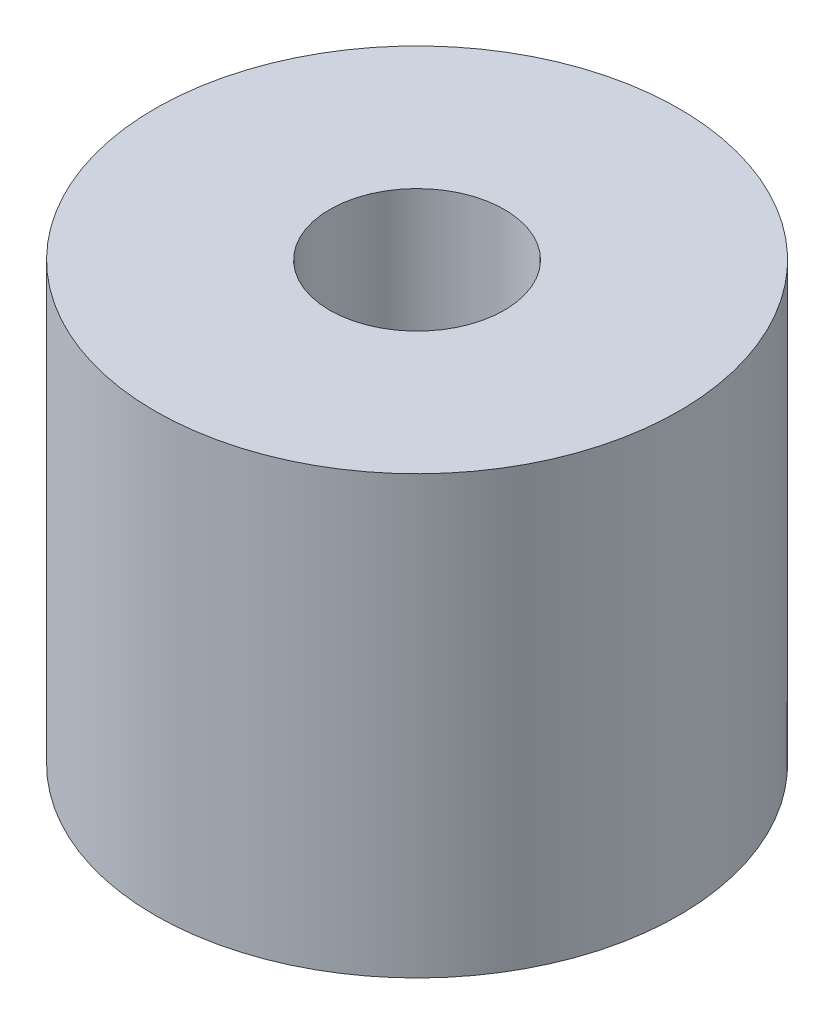
ISO-10303-21;
HEADER;
FILE_DESCRIPTION(('STEP AP214'),'2;1');
FILE_NAME('part.step','',(''),(''),'','','');
FILE_SCHEMA(('AUTOMOTIVE_DESIGN { 1 0 10303 214 1 1 1 1 }'));
ENDSEC;
DATA;
#1=APPLICATION_CONTEXT('core data for automotive mechanical design processes');
#2=APPLICATION_PROTOCOL_DEFINITION('international standard','automotive_design',2000,#1);
#3=PRODUCT_CONTEXT('',#1,'mechanical');
#4=PRODUCT('Part','Part','',(#3));
#5=PRODUCT_RELATED_PRODUCT_CATEGORY('part','',(#4));
#6=PRODUCT_DEFINITION_FORMATION('','',#4);
#7=PRODUCT_DEFINITION_CONTEXT('part definition',#1,'design');
#8=PRODUCT_DEFINITION('design','',#6,#7);
#9=PRODUCT_DEFINITION_SHAPE('','',#8);
#10=(LENGTH_UNIT() NAMED_UNIT(*) SI_UNIT(.MILLI.,.METRE.));
#11=(NAMED_UNIT(*) PLANE_ANGLE_UNIT() SI_UNIT($,.RADIAN.));
#12=(NAMED_UNIT(*) SI_UNIT($,.STERADIAN.) SOLID_ANGLE_UNIT());
#13=UNCERTAINTY_MEASURE_WITH_UNIT(LENGTH_MEASURE(1.E-05),#10,'distance_accuracy_value','');
#14=(GEOMETRIC_REPRESENTATION_CONTEXT(3) GLOBAL_UNCERTAINTY_ASSIGNED_CONTEXT((#13)) GLOBAL_UNIT_ASSIGNED_CONTEXT((#10,
#11,#12)) REPRESENTATION_CONTEXT('',''));
#15=CARTESIAN_POINT('',(0.,0.,0.));
#16=DIRECTION('',(0.,0.,1.));
#17=DIRECTION('',(1.,0.,0.));
#18=AXIS2_PLACEMENT_3D('',#15,#16,#17);
#19=CARTESIAN_POINT('',(0.,25.,0.));
#20=DIRECTION('',(0.,1.,0.));
#21=DIRECTION('',(0.,0.,1.));
#22=AXIS2_PLACEMENT_3D('',#19,#20,#21);
#23=PLANE('',#22);
#24=CARTESIAN_POINT('',(0.,25.,0.));
#25=DIRECTION('',(0.,1.,0.));
#26=DIRECTION('',(0.,0.,1.));
#27=AXIS2_PLACEMENT_3D('',#24,#25,#26);
#28=CIRCLE('',#27,15.);
#29=CARTESIAN_POINT('',(0.,25.,15.));
#30=VERTEX_POINT('',#29);
#31=EDGE_CURVE('E10',#30,#30,#28,.T.);
#32=ORIENTED_EDGE('',*,*,#31,.T.);
#33=EDGE_LOOP('',(#32));
#34=FACE_BOUND('',#33,.T.);
#35=CARTESIAN_POINT('',(0.,25.,0.));
#36=DIRECTION('',(0.,1.,0.));
#37=DIRECTION('',(0.,0.,1.));
#38=AXIS2_PLACEMENT_3D('',#35,#36,#37);
#39=CIRCLE('',#38,5.);
#40=CARTESIAN_POINT('',(0.,25.,5.));
#41=VERTEX_POINT('',#40);
#42=EDGE_CURVE('E40',#41,#41,#39,.T.);
#43=ORIENTED_EDGE('',*,*,#42,.F.);
#44=EDGE_LOOP('',(#43));
#45=FACE_BOUND('',#44,.T.);
#46=ADVANCED_FACE('F29',(#34,#45),#23,.T.);
#47=CARTESIAN_POINT('',(0.,0.,0.));
#48=DIRECTION('',(0.,1.,0.));
#49=DIRECTION('',(0.,0.,1.));
#50=AXIS2_PLACEMENT_3D('',#47,#48,#49);
#51=PLANE('',#50);
#52=CARTESIAN_POINT('',(0.,0.,0.));
#53=DIRECTION('',(0.,1.,0.));
#54=DIRECTION('',(0.,0.,1.));
#55=AXIS2_PLACEMENT_3D('',#52,#53,#54);
#56=CIRCLE('',#55,15.);
#57=CARTESIAN_POINT('',(0.,0.,15.));
#58=VERTEX_POINT('',#57);
#59=EDGE_CURVE('E33',#58,#58,#56,.T.);
#60=ORIENTED_EDGE('',*,*,#59,.F.);
#61=EDGE_LOOP('',(#60));
#62=FACE_BOUND('',#61,.T.);
#63=CARTESIAN_POINT('',(0.,0.,0.));
#64=DIRECTION('',(0.,1.,0.));
#65=DIRECTION('',(0.,0.,1.));
#66=AXIS2_PLACEMENT_3D('',#63,#64,#65);
#67=CIRCLE('',#66,5.);
#68=CARTESIAN_POINT('',(0.,0.,5.));
#69=VERTEX_POINT('',#68);
#70=EDGE_CURVE('E42',#69,#69,#67,.T.);
#71=ORIENTED_EDGE('',*,*,#70,.T.);
#72=EDGE_LOOP('',(#71));
#73=FACE_BOUND('',#72,.T.);
#74=ADVANCED_FACE('F52',(#62,#73),#51,.F.);
#75=CARTESIAN_POINT('',(0.,25.,0.));
#76=DIRECTION('',(0.,-1.,0.));
#77=DIRECTION('',(0.,0.,-1.));
#78=AXIS2_PLACEMENT_3D('',#75,#76,#77);
#79=CYLINDRICAL_SURFACE('',#78,15.);
#80=ORIENTED_EDGE('',*,*,#31,.F.);
#81=EDGE_LOOP('',(#80));
#82=FACE_BOUND('',#81,.T.);
#83=ORIENTED_EDGE('',*,*,#59,.T.);
#84=EDGE_LOOP('',(#83));
#85=FACE_BOUND('',#84,.T.);
#86=ADVANCED_FACE('F31',(#82,#85),#79,.T.);
#87=CARTESIAN_POINT('',(0.,25.,0.));
#88=DIRECTION('',(0.,-1.,0.));
#89=DIRECTION('',(0.,0.,-1.));
#90=AXIS2_PLACEMENT_3D('',#87,#88,#89);
#91=CYLINDRICAL_SURFACE('',#90,5.);
#92=ORIENTED_EDGE('',*,*,#42,.T.);
#93=EDGE_LOOP('',(#92));
#94=FACE_BOUND('',#93,.T.);
#95=ORIENTED_EDGE('',*,*,#70,.F.);
#96=EDGE_LOOP('',(#95));
#97=FACE_BOUND('',#96,.T.);
#98=ADVANCED_FACE('F48',(#94,#97),#91,.F.);
#99=CLOSED_SHELL('',(#46,#74,#86,#98));
#100=MANIFOLD_SOLID_BREP('B2',#99);
#101=ADVANCED_BREP_SHAPE_REPRESENTATION('',(#18,#100),#14);
#102=SHAPE_DEFINITION_REPRESENTATION(#9,#101);
ENDSEC;
END-ISO-10303-21;
